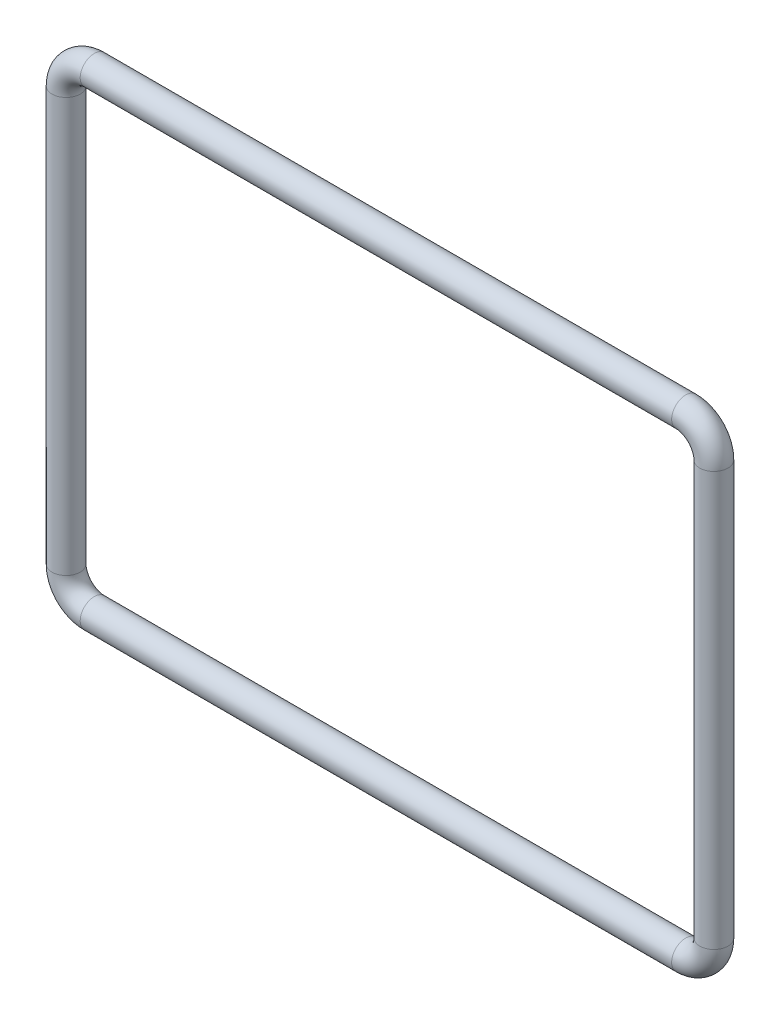
ISO-10303-21;
HEADER;
FILE_DESCRIPTION(('STEP AP214'),'2;1');
FILE_NAME('part.step','',(''),(''),'','','');
FILE_SCHEMA(('AUTOMOTIVE_DESIGN { 1 0 10303 214 1 1 1 1 }'));
ENDSEC;
DATA;
#1=APPLICATION_CONTEXT('core data for automotive mechanical design processes');
#2=APPLICATION_PROTOCOL_DEFINITION('international standard','automotive_design',2000,#1);
#3=PRODUCT_CONTEXT('',#1,'mechanical');
#4=PRODUCT('Part','Part','',(#3));
#5=PRODUCT_RELATED_PRODUCT_CATEGORY('part','',(#4));
#6=PRODUCT_DEFINITION_FORMATION('','',#4);
#7=PRODUCT_DEFINITION_CONTEXT('part definition',#1,'design');
#8=PRODUCT_DEFINITION('design','',#6,#7);
#9=PRODUCT_DEFINITION_SHAPE('','',#8);
#10=(LENGTH_UNIT() NAMED_UNIT(*) SI_UNIT(.MILLI.,.METRE.));
#11=(NAMED_UNIT(*) PLANE_ANGLE_UNIT() SI_UNIT($,.RADIAN.));
#12=(NAMED_UNIT(*) SI_UNIT($,.STERADIAN.) SOLID_ANGLE_UNIT());
#13=UNCERTAINTY_MEASURE_WITH_UNIT(LENGTH_MEASURE(1.E-05),#10,'distance_accuracy_value','');
#14=(GEOMETRIC_REPRESENTATION_CONTEXT(3) GLOBAL_UNCERTAINTY_ASSIGNED_CONTEXT((#13)) GLOBAL_UNIT_ASSIGNED_CONTEXT((#10,
#11,#12)) REPRESENTATION_CONTEXT('',''));
#15=CARTESIAN_POINT('',(0.,0.,0.));
#16=DIRECTION('',(0.,0.,1.));
#17=DIRECTION('',(1.,0.,0.));
#18=AXIS2_PLACEMENT_3D('',#15,#16,#17);
#19=CARTESIAN_POINT('',(-200.,140.,0.));
#20=DIRECTION('',(0.,0.,-1.));
#21=DIRECTION('',(-1.,0.,0.));
#22=AXIS2_PLACEMENT_3D('',#19,#20,#21);
#23=TOROIDAL_SURFACE('',#22,9.52500000000001,4.76250000000002);
#24=CARTESIAN_POINT('',(-209.525,140.,0.));
#25=DIRECTION('',(0.,1.,0.));
#26=DIRECTION('',(0.,0.,-1.));
#27=AXIS2_PLACEMENT_3D('',#24,#25,#26);
#28=CIRCLE('',#27,4.76250000000002);
#29=CARTESIAN_POINT('',(-214.2875,140.,0.));
#30=VERTEX_POINT('',#29);
#31=EDGE_CURVE('E10',#30,#30,#28,.T.);
#32=CARTESIAN_POINT('',(-200.,149.525,0.));
#33=DIRECTION('',(1.,0.,0.));
#34=DIRECTION('',(0.,0.,-1.));
#35=AXIS2_PLACEMENT_3D('',#32,#33,#34);
#36=CIRCLE('',#35,4.76250000000002);
#37=CARTESIAN_POINT('',(-200.,154.2875,0.));
#38=VERTEX_POINT('',#37);
#39=EDGE_CURVE('E61',#38,#38,#36,.T.);
#40=CARTESIAN_POINT('',(-200.,140.,0.));
#41=DIRECTION('',(0.,0.,-1.));
#42=DIRECTION('',(-1.,0.,0.));
#43=AXIS2_PLACEMENT_3D('',#40,#41,#42);
#44=CIRCLE('',#43,14.2875);
#45=EDGE_CURVE('',#30,#38,#44,.T.);
#46=ORIENTED_EDGE('',*,*,#31,.T.);
#47=ORIENTED_EDGE('',*,*,#39,.F.);
#48=ORIENTED_EDGE('',*,*,#45,.T.);
#49=ORIENTED_EDGE('',*,*,#45,.F.);
#50=EDGE_LOOP('',(#46,#48,#47,#49));
#51=FACE_BOUND('',#50,.T.);
#52=ADVANCED_FACE('F33',(#51),#23,.T.);
#53=CARTESIAN_POINT('',(-209.525,0.,0.));
#54=DIRECTION('',(0.,1.,0.));
#55=DIRECTION('',(-1.,0.,0.));
#56=AXIS2_PLACEMENT_3D('',#53,#54,#55);
#57=CYLINDRICAL_SURFACE('',#56,4.76250000000002);
#58=ORIENTED_EDGE('',*,*,#31,.F.);
#59=EDGE_LOOP('',(#58));
#60=FACE_BOUND('',#59,.T.);
#61=CARTESIAN_POINT('',(-209.525,0.,0.));
#62=DIRECTION('',(0.,1.,0.));
#63=DIRECTION('',(0.,0.,-1.));
#64=AXIS2_PLACEMENT_3D('',#61,#62,#63);
#65=CIRCLE('',#64,4.76250000000002);
#66=CARTESIAN_POINT('',(-214.2875,0.,0.));
#67=VERTEX_POINT('',#66);
#68=EDGE_CURVE('E39',#67,#67,#65,.T.);
#69=ORIENTED_EDGE('',*,*,#68,.T.);
#70=EDGE_LOOP('',(#69));
#71=FACE_BOUND('',#70,.T.);
#72=ADVANCED_FACE('F68',(#60,#71),#57,.T.);
#73=CARTESIAN_POINT('',(-200.,0.,0.));
#74=DIRECTION('',(0.,0.,-1.));
#75=DIRECTION('',(-1.,0.,0.));
#76=AXIS2_PLACEMENT_3D('',#73,#74,#75);
#77=TOROIDAL_SURFACE('',#76,9.52499999999998,4.76250000000002);
#78=CARTESIAN_POINT('',(-200.,-9.52500000000001,0.));
#79=DIRECTION('',(-1.,0.,0.));
#80=DIRECTION('',(0.,0.,-1.));
#81=AXIS2_PLACEMENT_3D('',#78,#79,#80);
#82=CIRCLE('',#81,4.76250000000002);
#83=CARTESIAN_POINT('',(-200.,-14.2875,0.));
#84=VERTEX_POINT('',#83);
#85=EDGE_CURVE('E43',#84,#84,#82,.T.);
#86=CARTESIAN_POINT('',(-200.,0.,0.));
#87=DIRECTION('',(0.,0.,-1.));
#88=DIRECTION('',(-1.,0.,0.));
#89=AXIS2_PLACEMENT_3D('',#86,#87,#88);
#90=CIRCLE('',#89,14.2875);
#91=EDGE_CURVE('',#84,#67,#90,.T.);
#92=ORIENTED_EDGE('',*,*,#85,.T.);
#93=ORIENTED_EDGE('',*,*,#68,.F.);
#94=ORIENTED_EDGE('',*,*,#91,.T.);
#95=ORIENTED_EDGE('',*,*,#91,.F.);
#96=EDGE_LOOP('',(#92,#94,#93,#95));
#97=FACE_BOUND('',#96,.T.);
#98=ADVANCED_FACE('F72',(#97),#77,.T.);
#99=CARTESIAN_POINT('',(0.,-9.52499999999998,0.));
#100=DIRECTION('',(-1.,0.,0.));
#101=DIRECTION('',(0.,-1.,0.));
#102=AXIS2_PLACEMENT_3D('',#99,#100,#101);
#103=CYLINDRICAL_SURFACE('',#102,4.76250000000002);
#104=ORIENTED_EDGE('',*,*,#85,.F.);
#105=EDGE_LOOP('',(#104));
#106=FACE_BOUND('',#105,.T.);
#107=CARTESIAN_POINT('',(0.,-9.52499999999998,0.));
#108=DIRECTION('',(-1.,0.,0.));
#109=DIRECTION('',(0.,0.,-1.));
#110=AXIS2_PLACEMENT_3D('',#107,#108,#109);
#111=CIRCLE('',#110,4.76250000000002);
#112=CARTESIAN_POINT('',(0.,-14.2875,0.));
#113=VERTEX_POINT('',#112);
#114=EDGE_CURVE('E47',#113,#113,#111,.T.);
#115=ORIENTED_EDGE('',*,*,#114,.T.);
#116=EDGE_LOOP('',(#115));
#117=FACE_BOUND('',#116,.T.);
#118=ADVANCED_FACE('F77',(#106,#117),#103,.T.);
#119=CARTESIAN_POINT('',(0.,0.,0.));
#120=DIRECTION('',(0.,0.,-1.));
#121=DIRECTION('',(-1.,0.,0.));
#122=AXIS2_PLACEMENT_3D('',#119,#120,#121);
#123=TOROIDAL_SURFACE('',#122,9.52499999999998,4.76250000000002);
#124=CARTESIAN_POINT('',(9.52500000000001,0.,0.));
#125=DIRECTION('',(0.,-1.,0.));
#126=DIRECTION('',(0.,0.,-1.));
#127=AXIS2_PLACEMENT_3D('',#124,#125,#126);
#128=CIRCLE('',#127,4.76250000000002);
#129=CARTESIAN_POINT('',(14.2875,0.,0.));
#130=VERTEX_POINT('',#129);
#131=EDGE_CURVE('E52',#130,#130,#128,.T.);
#132=CARTESIAN_POINT('',(0.,0.,0.));
#133=DIRECTION('',(0.,0.,-1.));
#134=DIRECTION('',(-1.,0.,0.));
#135=AXIS2_PLACEMENT_3D('',#132,#133,#134);
#136=CIRCLE('',#135,14.2875);
#137=EDGE_CURVE('',#130,#113,#136,.T.);
#138=ORIENTED_EDGE('',*,*,#131,.T.);
#139=ORIENTED_EDGE('',*,*,#114,.F.);
#140=ORIENTED_EDGE('',*,*,#137,.T.);
#141=ORIENTED_EDGE('',*,*,#137,.F.);
#142=EDGE_LOOP('',(#138,#140,#139,#141));
#143=FACE_BOUND('',#142,.T.);
#144=ADVANCED_FACE('F83',(#143),#123,.T.);
#145=CARTESIAN_POINT('',(9.52500000000001,140.,0.));
#146=DIRECTION('',(0.,-1.,0.));
#147=DIRECTION('',(0.,0.,-1.));
#148=AXIS2_PLACEMENT_3D('',#145,#146,#147);
#149=CYLINDRICAL_SURFACE('',#148,4.76250000000002);
#150=ORIENTED_EDGE('',*,*,#131,.F.);
#151=EDGE_LOOP('',(#150));
#152=FACE_BOUND('',#151,.T.);
#153=CARTESIAN_POINT('',(9.52500000000001,140.,0.));
#154=DIRECTION('',(0.,-1.,0.));
#155=DIRECTION('',(0.,0.,-1.));
#156=AXIS2_PLACEMENT_3D('',#153,#154,#155);
#157=CIRCLE('',#156,4.76250000000002);
#158=CARTESIAN_POINT('',(14.2875,140.,0.));
#159=VERTEX_POINT('',#158);
#160=EDGE_CURVE('E55',#159,#159,#157,.T.);
#161=ORIENTED_EDGE('',*,*,#160,.T.);
#162=EDGE_LOOP('',(#161));
#163=FACE_BOUND('',#162,.T.);
#164=ADVANCED_FACE('F87',(#152,#163),#149,.T.);
#165=CARTESIAN_POINT('',(0.,140.,0.));
#166=DIRECTION('',(0.,0.,-1.));
#167=DIRECTION('',(-1.,0.,0.));
#168=AXIS2_PLACEMENT_3D('',#165,#166,#167);
#169=TOROIDAL_SURFACE('',#168,9.52500000000001,4.76250000000002);
#170=CARTESIAN_POINT('',(0.,149.525,0.));
#171=DIRECTION('',(1.,0.,0.));
#172=DIRECTION('',(0.,0.,-1.));
#173=AXIS2_PLACEMENT_3D('',#170,#171,#172);
#174=CIRCLE('',#173,4.76250000000002);
#175=CARTESIAN_POINT('',(0.,154.2875,0.));
#176=VERTEX_POINT('',#175);
#177=EDGE_CURVE('E58',#176,#176,#174,.T.);
#178=CARTESIAN_POINT('',(0.,140.,0.));
#179=DIRECTION('',(0.,0.,-1.));
#180=DIRECTION('',(-1.,0.,0.));
#181=AXIS2_PLACEMENT_3D('',#178,#179,#180);
#182=CIRCLE('',#181,14.2875);
#183=EDGE_CURVE('',#176,#159,#182,.T.);
#184=ORIENTED_EDGE('',*,*,#177,.T.);
#185=ORIENTED_EDGE('',*,*,#160,.F.);
#186=ORIENTED_EDGE('',*,*,#183,.T.);
#187=ORIENTED_EDGE('',*,*,#183,.F.);
#188=EDGE_LOOP('',(#184,#186,#185,#187));
#189=FACE_BOUND('',#188,.T.);
#190=ADVANCED_FACE('F91',(#189),#169,.T.);
#191=CARTESIAN_POINT('',(-200.,149.525,0.));
#192=DIRECTION('',(1.,0.,0.));
#193=DIRECTION('',(0.,1.,0.));
#194=AXIS2_PLACEMENT_3D('',#191,#192,#193);
#195=CYLINDRICAL_SURFACE('',#194,4.76250000000002);
#196=ORIENTED_EDGE('',*,*,#177,.F.);
#197=EDGE_LOOP('',(#196));
#198=FACE_BOUND('',#197,.T.);
#199=ORIENTED_EDGE('',*,*,#39,.T.);
#200=EDGE_LOOP('',(#199));
#201=FACE_BOUND('',#200,.T.);
#202=ADVANCED_FACE('F65',(#198,#201),#195,.T.);
#203=CLOSED_SHELL('',(#52,#72,#98,#118,#144,#164,#190,#202));
#204=MANIFOLD_SOLID_BREP('B2',#203);
#205=ADVANCED_BREP_SHAPE_REPRESENTATION('',(#18,#204),#14);
#206=SHAPE_DEFINITION_REPRESENTATION(#9,#205);
ENDSEC;
END-ISO-10303-21;
